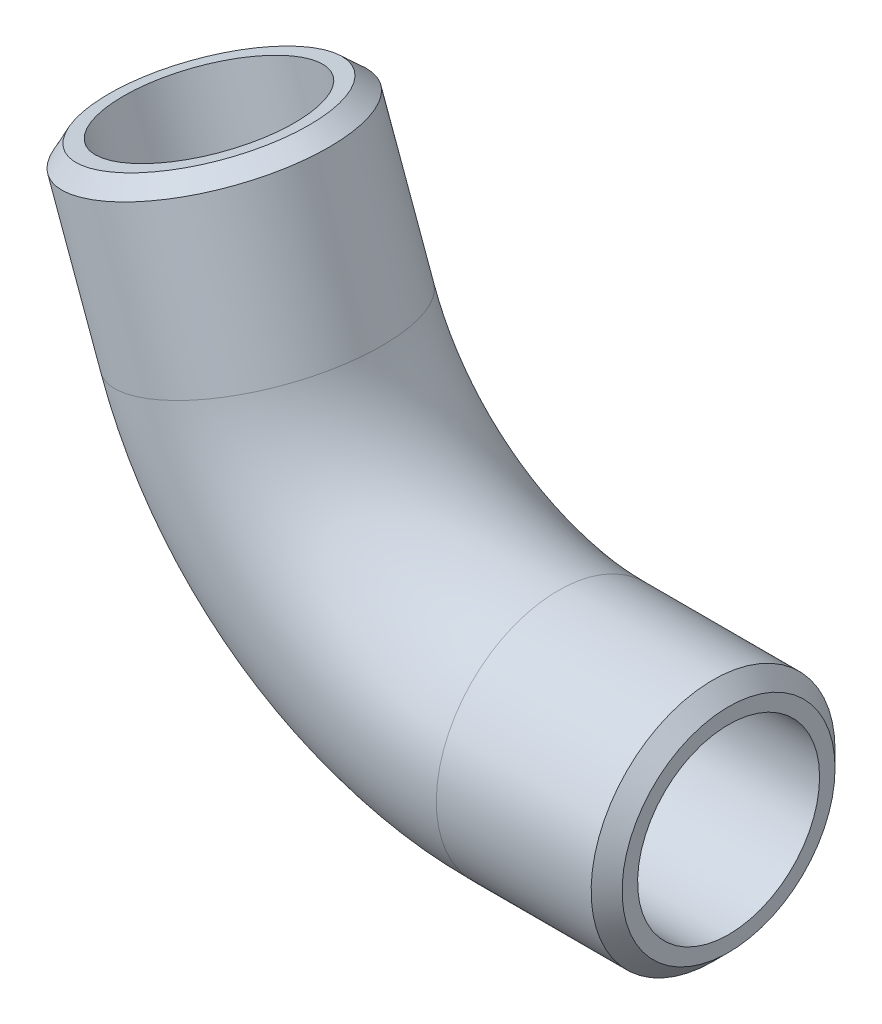
ISO-10303-21;
HEADER;
FILE_DESCRIPTION(('STEP AP214'),'2;1');
FILE_NAME('part.step','',(''),(''),'','','');
FILE_SCHEMA(('AUTOMOTIVE_DESIGN { 1 0 10303 214 1 1 1 1 }'));
ENDSEC;
DATA;
#1=APPLICATION_CONTEXT('core data for automotive mechanical design processes');
#2=APPLICATION_PROTOCOL_DEFINITION('international standard','automotive_design',2000,#1);
#3=PRODUCT_CONTEXT('',#1,'mechanical');
#4=PRODUCT('Part','Part','',(#3));
#5=PRODUCT_RELATED_PRODUCT_CATEGORY('part','',(#4));
#6=PRODUCT_DEFINITION_FORMATION('','',#4);
#7=PRODUCT_DEFINITION_CONTEXT('part definition',#1,'design');
#8=PRODUCT_DEFINITION('design','',#6,#7);
#9=PRODUCT_DEFINITION_SHAPE('','',#8);
#10=(LENGTH_UNIT() NAMED_UNIT(*) SI_UNIT(.MILLI.,.METRE.));
#11=(NAMED_UNIT(*) PLANE_ANGLE_UNIT() SI_UNIT($,.RADIAN.));
#12=(NAMED_UNIT(*) SI_UNIT($,.STERADIAN.) SOLID_ANGLE_UNIT());
#13=UNCERTAINTY_MEASURE_WITH_UNIT(LENGTH_MEASURE(1.E-05),#10,'distance_accuracy_value','');
#14=(GEOMETRIC_REPRESENTATION_CONTEXT(3) GLOBAL_UNCERTAINTY_ASSIGNED_CONTEXT((#13)) GLOBAL_UNIT_ASSIGNED_CONTEXT((#10,
#11,#12)) REPRESENTATION_CONTEXT('',''));
#15=CARTESIAN_POINT('',(0.,0.,0.));
#16=DIRECTION('',(0.,0.,1.));
#17=DIRECTION('',(1.,0.,0.));
#18=AXIS2_PLACEMENT_3D('',#15,#16,#17);
#19=CARTESIAN_POINT('',(0.,0.,0.));
#20=DIRECTION('',(-1.,0.,0.));
#21=DIRECTION('',(0.,0.,1.));
#22=AXIS2_PLACEMENT_3D('',#19,#20,#21);
#23=CYLINDRICAL_SURFACE('',#22,15.75);
#24=CARTESIAN_POINT('',(-1.99999999999997,0.,0.));
#25=DIRECTION('',(1.,0.,0.));
#26=DIRECTION('',(0.,0.,-1.));
#27=AXIS2_PLACEMENT_3D('',#24,#25,#26);
#28=CIRCLE('',#27,15.75);
#29=CARTESIAN_POINT('',(-1.99999999999997,0.,-15.75));
#30=VERTEX_POINT('',#29);
#31=EDGE_CURVE('E47',#30,#30,#28,.F.);
#32=ORIENTED_EDGE('',*,*,#31,.T.);
#33=EDGE_LOOP('',(#32));
#34=FACE_BOUND('',#33,.T.);
#35=CARTESIAN_POINT('',(-21.9916984716117,0.,0.));
#36=DIRECTION('',(1.,0.,0.));
#37=DIRECTION('',(0.,0.,-1.));
#38=AXIS2_PLACEMENT_3D('',#35,#36,#37);
#39=CIRCLE('',#38,15.75);
#40=CARTESIAN_POINT('',(-21.9916984716117,-15.75,0.));
#41=VERTEX_POINT('',#40);
#42=EDGE_CURVE('E61',#41,#41,#39,.T.);
#43=ORIENTED_EDGE('',*,*,#42,.T.);
#44=EDGE_LOOP('',(#43));
#45=FACE_BOUND('',#44,.T.);
#46=ADVANCED_FACE('F35',(#34,#45),#23,.T.);
#47=CARTESIAN_POINT('',(-21.9916984716117,40.,0.));
#48=DIRECTION('',(0.,0.,-1.));
#49=DIRECTION('',(-1.,0.,0.));
#50=AXIS2_PLACEMENT_3D('',#47,#48,#49);
#51=TOROIDAL_SURFACE('',#50,40.,15.75);
#52=CARTESIAN_POINT('',(-59.579403303048,26.3191942669731,0.));
#53=DIRECTION('',(0.342020143325673,-0.939692620785907,0.));
#54=DIRECTION('',(0.,0.,-1.));
#55=AXIS2_PLACEMENT_3D('',#52,#53,#54);
#56=CIRCLE('',#55,15.75);
#57=CARTESIAN_POINT('',(-74.379562080426,20.9323770095937,0.));
#58=VERTEX_POINT('',#57);
#59=EDGE_CURVE('E57',#58,#58,#56,.T.);
#60=CARTESIAN_POINT('',(-21.9916984716117,40.,0.));
#61=DIRECTION('',(0.,0.,-1.));
#62=DIRECTION('',(-1.,0.,0.));
#63=AXIS2_PLACEMENT_3D('',#60,#61,#62);
#64=CIRCLE('',#63,55.75);
#65=EDGE_CURVE('',#41,#58,#64,.T.);
#66=ORIENTED_EDGE('',*,*,#42,.F.);
#67=ORIENTED_EDGE('',*,*,#59,.T.);
#68=ORIENTED_EDGE('',*,*,#65,.T.);
#69=ORIENTED_EDGE('',*,*,#65,.F.);
#70=EDGE_LOOP('',(#66,#68,#67,#69));
#71=FACE_BOUND('',#70,.T.);
#72=ADVANCED_FACE('F107',(#71),#51,.T.);
#73=CARTESIAN_POINT('',(-59.579403303048,26.3191942669731,0.));
#74=DIRECTION('',(-0.342020143325674,0.939692620785906,0.));
#75=DIRECTION('',(-0.939692620785907,-0.342020143325674,0.));
#76=AXIS2_PLACEMENT_3D('',#73,#74,#75);
#77=CYLINDRICAL_SURFACE('',#76,15.75);
#78=CARTESIAN_POINT('',(-66.4169668796323,45.1052457977235,0.));
#79=DIRECTION('',(0.342020143325673,-0.939692620785907,0.));
#80=DIRECTION('',(0.939692620785907,0.342020143325673,0.));
#81=AXIS2_PLACEMENT_3D('',#78,#79,#80);
#82=CIRCLE('',#81,15.75);
#83=CARTESIAN_POINT('',(-81.2171256570103,39.7184285403442,0.));
#84=VERTEX_POINT('',#83);
#85=EDGE_CURVE('E43',#84,#84,#82,.T.);
#86=CARTESIAN_POINT('',(-81.2171256570103,39.7184285403442,0.));
#87=CARTESIAN_POINT('',(-81.1459010364209,39.5227405035655,0.));
#88=CARTESIAN_POINT('',(-81.0746764158315,39.3270524667869,0.));
#89=CARTESIAN_POINT('',(-80.9322271746527,38.9356763932296,0.));
#90=CARTESIAN_POINT('',(-80.8610025540632,38.7399883564509,0.));
#91=CARTESIAN_POINT('',(-80.7185533128844,38.3486122828936,0.));
#92=CARTESIAN_POINT('',(-80.647328692295,38.152924246115,0.));
#93=CARTESIAN_POINT('',(-80.5048794511161,37.7615481725577,0.));
#94=CARTESIAN_POINT('',(-80.4336548305267,37.565860135779,0.));
#95=CARTESIAN_POINT('',(-80.2912055893479,37.1744840622217,0.));
#96=CARTESIAN_POINT('',(-80.2199809687585,36.9787960254431,0.));
#97=CARTESIAN_POINT('',(-80.0775317275796,36.5874199518858,0.));
#98=CARTESIAN_POINT('',(-80.0063071069902,36.3917319151071,0.));
#99=CARTESIAN_POINT('',(-79.8638578658114,36.0003558415498,0.));
#100=CARTESIAN_POINT('',(-79.7926332452219,35.8046678047712,0.));
#101=CARTESIAN_POINT('',(-79.6501840040431,35.4132917312139,0.));
#102=CARTESIAN_POINT('',(-79.5789593834537,35.2176036944352,0.));
#103=CARTESIAN_POINT('',(-79.4365101422748,34.8262276208779,0.));
#104=CARTESIAN_POINT('',(-79.3652855216854,34.6305395840993,0.));
#105=CARTESIAN_POINT('',(-79.2228362805066,34.239163510542,0.));
#106=CARTESIAN_POINT('',(-79.1516116599172,34.0434754737633,0.));
#107=CARTESIAN_POINT('',(-79.0091624187383,33.652099400206,0.));
#108=CARTESIAN_POINT('',(-78.9379377981489,33.4564113634273,0.));
#109=CARTESIAN_POINT('',(-78.7954885569701,33.0650352898701,0.));
#110=CARTESIAN_POINT('',(-78.7242639363806,32.8693472530914,0.));
#111=CARTESIAN_POINT('',(-78.5818146952018,32.4779711795341,0.));
#112=CARTESIAN_POINT('',(-78.5105900746124,32.2822831427554,0.));
#113=CARTESIAN_POINT('',(-78.3681408334335,31.8909070691981,0.));
#114=CARTESIAN_POINT('',(-78.2969162128441,31.6952190324195,0.));
#115=CARTESIAN_POINT('',(-78.1544669716653,31.3038429588622,0.));
#116=CARTESIAN_POINT('',(-78.0832423510759,31.1081549220835,0.));
#117=CARTESIAN_POINT('',(-77.940793109897,30.7167788485263,0.));
#118=CARTESIAN_POINT('',(-77.8695684893076,30.5210908117476,0.));
#119=CARTESIAN_POINT('',(-77.7271192481287,30.1297147381903,0.));
#120=CARTESIAN_POINT('',(-77.6558946275393,29.9340267014116,0.));
#121=CARTESIAN_POINT('',(-77.5134453863605,29.5426506278543,0.));
#122=CARTESIAN_POINT('',(-77.4422207657711,29.3469625910757,0.));
#123=CARTESIAN_POINT('',(-77.2997715245922,28.9555865175184,0.));
#124=CARTESIAN_POINT('',(-77.2285469040028,28.7598984807397,0.));
#125=CARTESIAN_POINT('',(-77.086097662824,28.3685224071824,0.));
#126=CARTESIAN_POINT('',(-77.0148730422346,28.1728343704038,0.));
#127=CARTESIAN_POINT('',(-76.8724238010557,27.7814582968465,0.));
#128=CARTESIAN_POINT('',(-76.8011991804663,27.5857702600678,0.));
#129=CARTESIAN_POINT('',(-76.6587499392875,27.1943941865105,0.));
#130=CARTESIAN_POINT('',(-76.587525318698,26.9987061497319,0.));
#131=CARTESIAN_POINT('',(-76.4450760775192,26.6073300761746,0.));
#132=CARTESIAN_POINT('',(-76.3738514569298,26.4116420393959,0.));
#133=CARTESIAN_POINT('',(-76.2314022157509,26.0202659658386,0.));
#134=CARTESIAN_POINT('',(-76.1601775951615,25.82457792906,0.));
#135=CARTESIAN_POINT('',(-76.0177283539827,25.4332018555027,0.));
#136=CARTESIAN_POINT('',(-75.9465037333933,25.237513818724,0.));
#137=CARTESIAN_POINT('',(-75.8040544922144,24.8461377451667,0.));
#138=CARTESIAN_POINT('',(-75.732829871625,24.6504497083881,0.));
#139=CARTESIAN_POINT('',(-75.5903806304462,24.2590736348308,0.));
#140=CARTESIAN_POINT('',(-75.5191560098567,24.0633855980521,0.));
#141=CARTESIAN_POINT('',(-75.3767067686779,23.6720095244948,0.));
#142=CARTESIAN_POINT('',(-75.3054821480885,23.4763214877162,0.));
#143=CARTESIAN_POINT('',(-75.1630329069096,23.0849454141589,0.));
#144=CARTESIAN_POINT('',(-75.0918082863202,22.8892573773802,0.));
#145=CARTESIAN_POINT('',(-74.9493590451414,22.4978813038229,0.));
#146=CARTESIAN_POINT('',(-74.878134424552,22.3021932670443,0.));
#147=CARTESIAN_POINT('',(-74.7356851833731,21.910817193487,0.));
#148=CARTESIAN_POINT('',(-74.6644605627837,21.7151291567083,0.));
#149=CARTESIAN_POINT('',(-74.5220113216049,21.323753083151,0.));
#150=CARTESIAN_POINT('',(-74.4507867010154,21.1280650463724,0.));
#151=CARTESIAN_POINT('',(-74.379562080426,20.9323770095937,0.));
#152=B_SPLINE_CURVE_WITH_KNOTS('',3,(#86,#87,#88,#89,#90,#91,#92,#93,#94,#95,#96,#97,#98,#99,
#100,#101,#102,#103,#104,#105,#106,#107,#108,#109,#110,#111,#112,#113,#114,#115,#116,#117,#118,
#119,#120,#121,#122,#123,#124,#125,#126,#127,#128,#129,#130,#131,#132,#133,#134,#135,#136,#137,
#138,#139,#140,#141,#142,#143,#144,#145,#146,#147,#148,#149,#150,#151),.UNSPECIFIED.,.F.,.F.,(4,
2,2,2,2,2,2,2,2,2,2,2,2,2,2,2,2,2,2,2,2,2,2,2,2,2,2,2,2,2,2,2,4),(0.,0.62474057723786,
1.24948115447573,1.87422173171359,2.49896230895146,3.12370288618932,3.74844346342719,
4.37318404066506,4.99792461790293,5.62266519514079,6.24740577237866,6.87214634961653,
7.49688692685439,8.12162750409226,8.74636808133012,9.37110865856799,9.99584923580586,
10.6205898130437,11.2453303902816,11.8700709675195,12.4948115447573,13.1195521219952,
13.7442926992331,14.3690332764709,14.9937738537088,15.6185144309467,16.2432550081845,
16.8679955854224,17.4927361626603,18.1174767398981,18.742217317136,19.3669578943739,
19.9916984716117),.UNSPECIFIED.);
#153=EDGE_CURVE('BSEAM103',#84,#58,#152,.T.);
#154=ORIENTED_EDGE('',*,*,#85,.T.);
#155=ORIENTED_EDGE('',*,*,#59,.F.);
#156=ORIENTED_EDGE('',*,*,#153,.T.);
#157=ORIENTED_EDGE('',*,*,#153,.F.);
#158=EDGE_LOOP('',(#154,#156,#155,#157));
#159=FACE_BOUND('',#158,.T.);
#160=ADVANCED_FACE('F103',(#159),#77,.T.);
#161=CARTESIAN_POINT('',(0.,0.,0.));
#162=DIRECTION('',(1.,0.,0.));
#163=DIRECTION('',(0.,0.,-1.));
#164=AXIS2_PLACEMENT_3D('',#161,#162,#163);
#165=PLANE('',#164);
#166=CARTESIAN_POINT('',(0.,0.,0.));
#167=DIRECTION('',(1.,0.,0.));
#168=DIRECTION('',(0.,0.,-1.));
#169=AXIS2_PLACEMENT_3D('',#166,#167,#168);
#170=CIRCLE('',#169,13.75);
#171=CARTESIAN_POINT('',(0.,0.,-13.75));
#172=VERTEX_POINT('',#171);
#173=EDGE_CURVE('E51',#172,#172,#170,.T.);
#174=ORIENTED_EDGE('',*,*,#173,.T.);
#175=EDGE_LOOP('',(#174));
#176=FACE_BOUND('',#175,.T.);
#177=CARTESIAN_POINT('',(0.,0.,0.));
#178=DIRECTION('',(1.,0.,0.));
#179=DIRECTION('',(0.,0.,-1.));
#180=AXIS2_PLACEMENT_3D('',#177,#178,#179);
#181=CIRCLE('',#180,11.75);
#182=CARTESIAN_POINT('',(0.,0.,-11.75));
#183=VERTEX_POINT('',#182);
#184=EDGE_CURVE('E60',#183,#183,#181,.F.);
#185=ORIENTED_EDGE('',*,*,#184,.T.);
#186=EDGE_LOOP('',(#185));
#187=FACE_BOUND('',#186,.T.);
#188=ADVANCED_FACE('F75',(#176,#187),#165,.T.);
#189=CARTESIAN_POINT('',(-67.1010071662836,46.9846310392953,0.));
#190=DIRECTION('',(0.342020143325674,-0.939692620785907,0.));
#191=DIRECTION('',(0.,0.,-1.));
#192=AXIS2_PLACEMENT_3D('',#189,#190,#191);
#193=PLANE('',#192);
#194=CARTESIAN_POINT('',(-67.1010071662836,46.9846310392953,0.));
#195=DIRECTION('',(0.342020143325674,-0.939692620785907,0.));
#196=DIRECTION('',(0.939692620785907,0.342020143325674,0.));
#197=AXIS2_PLACEMENT_3D('',#194,#195,#196);
#198=CIRCLE('',#197,13.75);
#199=CARTESIAN_POINT('',(-54.1802336304775,51.6874080100233,0.));
#200=VERTEX_POINT('',#199);
#201=EDGE_CURVE('E10',#200,#200,#198,.F.);
#202=ORIENTED_EDGE('',*,*,#201,.T.);
#203=EDGE_LOOP('',(#202));
#204=FACE_BOUND('',#203,.T.);
#205=CARTESIAN_POINT('',(-67.1010071662836,46.9846310392953,0.));
#206=DIRECTION('',(0.342020143325674,-0.939692620785907,0.));
#207=DIRECTION('',(0.,0.,-1.));
#208=AXIS2_PLACEMENT_3D('',#205,#206,#207);
#209=CIRCLE('',#208,11.75);
#210=CARTESIAN_POINT('',(-78.142395460518,42.9658943552187,0.));
#211=VERTEX_POINT('',#210);
#212=EDGE_CURVE('E56',#211,#211,#209,.F.);
#213=ORIENTED_EDGE('',*,*,#212,.F.);
#214=EDGE_LOOP('',(#213));
#215=FACE_BOUND('',#214,.T.);
#216=ADVANCED_FACE('F80',(#204,#215),#193,.F.);
#217=CARTESIAN_POINT('',(0.,0.,0.));
#218=DIRECTION('',(-1.,0.,0.));
#219=DIRECTION('',(0.,0.,1.));
#220=AXIS2_PLACEMENT_3D('',#217,#218,#219);
#221=CYLINDRICAL_SURFACE('',#220,11.75);
#222=CARTESIAN_POINT('',(-21.9916984716117,0.,0.));
#223=DIRECTION('',(1.,0.,0.));
#224=DIRECTION('',(0.,0.,-1.));
#225=AXIS2_PLACEMENT_3D('',#222,#223,#224);
#226=CIRCLE('',#225,11.75);
#227=CARTESIAN_POINT('',(-21.9916984716117,-11.75,0.));
#228=VERTEX_POINT('',#227);
#229=EDGE_CURVE('E69',#228,#228,#226,.F.);
#230=ORIENTED_EDGE('',*,*,#229,.T.);
#231=EDGE_LOOP('',(#230));
#232=FACE_BOUND('',#231,.T.);
#233=ORIENTED_EDGE('',*,*,#184,.F.);
#234=EDGE_LOOP('',(#233));
#235=FACE_BOUND('',#234,.T.);
#236=ADVANCED_FACE('F77',(#232,#235),#221,.F.);
#237=CARTESIAN_POINT('',(-21.9916984716117,40.,0.));
#238=DIRECTION('',(0.,0.,-1.));
#239=DIRECTION('',(-1.,0.,0.));
#240=AXIS2_PLACEMENT_3D('',#237,#238,#239);
#241=TOROIDAL_SURFACE('',#240,40.,11.75);
#242=CARTESIAN_POINT('',(-59.579403303048,26.3191942669731,0.));
#243=DIRECTION('',(0.342020143325673,-0.939692620785907,0.));
#244=DIRECTION('',(0.,0.,-1.));
#245=AXIS2_PLACEMENT_3D('',#242,#243,#244);
#246=CIRCLE('',#245,11.75);
#247=CARTESIAN_POINT('',(-70.6207915972824,22.3004575828964,0.));
#248=VERTEX_POINT('',#247);
#249=EDGE_CURVE('E66',#248,#248,#246,.F.);
#250=CARTESIAN_POINT('',(-21.9916984716117,40.,0.));
#251=DIRECTION('',(0.,0.,-1.));
#252=DIRECTION('',(-1.,0.,0.));
#253=AXIS2_PLACEMENT_3D('',#250,#251,#252);
#254=CIRCLE('',#253,51.75);
#255=EDGE_CURVE('',#228,#248,#254,.T.);
#256=ORIENTED_EDGE('',*,*,#229,.F.);
#257=ORIENTED_EDGE('',*,*,#249,.T.);
#258=ORIENTED_EDGE('',*,*,#255,.T.);
#259=ORIENTED_EDGE('',*,*,#255,.F.);
#260=EDGE_LOOP('',(#256,#258,#257,#259));
#261=FACE_BOUND('',#260,.T.);
#262=ADVANCED_FACE('F79',(#261),#241,.F.);
#263=CARTESIAN_POINT('',(-59.579403303048,26.3191942669731,0.));
#264=DIRECTION('',(-0.342020143325674,0.939692620785906,0.));
#265=DIRECTION('',(-0.939692620785907,-0.342020143325674,0.));
#266=AXIS2_PLACEMENT_3D('',#263,#264,#265);
#267=CYLINDRICAL_SURFACE('',#266,11.75);
#268=CARTESIAN_POINT('',(-78.142395460518,42.9658943552187,0.));
#269=CARTESIAN_POINT('',(-78.064045420276,42.7506293888403,0.));
#270=CARTESIAN_POINT('',(-77.985695380034,42.535364422462,0.));
#271=CARTESIAN_POINT('',(-77.8289952995499,42.1048344897052,0.));
#272=CARTESIAN_POINT('',(-77.7506452593079,41.8895695233269,0.));
#273=CARTESIAN_POINT('',(-77.5939451788238,41.4590395905702,0.));
#274=CARTESIAN_POINT('',(-77.5155951385817,41.2437746241918,0.));
#275=CARTESIAN_POINT('',(-77.3588950580977,40.8132446914351,0.));
#276=CARTESIAN_POINT('',(-77.2805450178556,40.5979797250568,0.));
#277=CARTESIAN_POINT('',(-77.1238449373716,40.1674497923,0.));
#278=CARTESIAN_POINT('',(-77.0454948971295,39.9521848259217,0.));
#279=CARTESIAN_POINT('',(-76.8887948166454,39.521654893165,0.));
#280=CARTESIAN_POINT('',(-76.8104447764034,39.3063899267866,0.));
#281=CARTESIAN_POINT('',(-76.6537446959193,38.8758599940299,0.));
#282=CARTESIAN_POINT('',(-76.5753946556773,38.6605950276515,0.));
#283=CARTESIAN_POINT('',(-76.4186945751932,38.2300650948948,0.));
#284=CARTESIAN_POINT('',(-76.3403445349512,38.0148001285165,0.));
#285=CARTESIAN_POINT('',(-76.1836444544671,37.5842701957598,0.));
#286=CARTESIAN_POINT('',(-76.1052944142251,37.3690052293814,0.));
#287=CARTESIAN_POINT('',(-75.948594333741,36.9384752966247,0.));
#288=CARTESIAN_POINT('',(-75.8702442934989,36.7232103302463,0.));
#289=CARTESIAN_POINT('',(-75.7135442130149,36.2926803974896,0.));
#290=CARTESIAN_POINT('',(-75.6351941727728,36.0774154311113,0.));
#291=CARTESIAN_POINT('',(-75.4784940922888,35.6468854983545,0.));
#292=CARTESIAN_POINT('',(-75.4001440520467,35.4316205319762,0.));
#293=CARTESIAN_POINT('',(-75.2434439715626,35.0010905992195,0.));
#294=CARTESIAN_POINT('',(-75.1650939313206,34.7858256328411,0.));
#295=CARTESIAN_POINT('',(-75.0083938508365,34.3552957000844,0.));
#296=CARTESIAN_POINT('',(-74.9300438105945,34.140030733706,0.));
#297=CARTESIAN_POINT('',(-74.7733437301104,33.7095008009493,0.));
#298=CARTESIAN_POINT('',(-74.6949936898684,33.494235834571,0.));
#299=CARTESIAN_POINT('',(-74.5382936093843,33.0637059018143,0.));
#300=CARTESIAN_POINT('',(-74.4599435691423,32.8484409354359,0.));
#301=CARTESIAN_POINT('',(-74.3032434886582,32.4179110026792,0.));
#302=CARTESIAN_POINT('',(-74.2248934484162,32.2026460363008,0.));
#303=CARTESIAN_POINT('',(-74.0681933679321,31.7721161035441,0.));
#304=CARTESIAN_POINT('',(-73.98984332769,31.5568511371658,0.));
#305=CARTESIAN_POINT('',(-73.833143247206,31.1263212044091,0.));
#306=CARTESIAN_POINT('',(-73.7547932069639,30.9110562380307,0.));
#307=CARTESIAN_POINT('',(-73.5980931264798,30.480526305274,0.));
#308=CARTESIAN_POINT('',(-73.5197430862378,30.2652613388956,0.));
#309=CARTESIAN_POINT('',(-73.3630430057537,29.8347314061389,0.));
#310=CARTESIAN_POINT('',(-73.2846929655117,29.6194664397606,0.));
#311=CARTESIAN_POINT('',(-73.1279928850276,29.1889365070038,0.));
#312=CARTESIAN_POINT('',(-73.0496428447856,28.9736715406255,0.));
#313=CARTESIAN_POINT('',(-72.8929427643015,28.5431416078688,0.));
#314=CARTESIAN_POINT('',(-72.8145927240595,28.3278766414904,0.));
#315=CARTESIAN_POINT('',(-72.6578926435754,27.8973467087337,0.));
#316=CARTESIAN_POINT('',(-72.5795426033334,27.6820817423553,0.));
#317=CARTESIAN_POINT('',(-72.4228425228493,27.2515518095986,0.));
#318=CARTESIAN_POINT('',(-72.3444924826072,27.0362868432203,0.));
#319=CARTESIAN_POINT('',(-72.1877924021232,26.6057569104636,0.));
#320=CARTESIAN_POINT('',(-72.1094423618811,26.3904919440852,0.));
#321=CARTESIAN_POINT('',(-71.9527422813971,25.9599620113285,0.));
#322=CARTESIAN_POINT('',(-71.874392241155,25.7446970449501,0.));
#323=CARTESIAN_POINT('',(-71.7176921606709,25.3141671121934,0.));
#324=CARTESIAN_POINT('',(-71.6393421204289,25.0989021458151,0.));
#325=CARTESIAN_POINT('',(-71.4826420399448,24.6683722130584,0.));
#326=CARTESIAN_POINT('',(-71.4042919997028,24.45310724668,0.));
#327=CARTESIAN_POINT('',(-71.2475919192187,24.0225773139233,0.));
#328=CARTESIAN_POINT('',(-71.1692418789767,23.8073123475449,0.));
#329=CARTESIAN_POINT('',(-71.0125417984926,23.3767824147882,0.));
#330=CARTESIAN_POINT('',(-70.9341917582505,23.1615174484099,0.));
#331=CARTESIAN_POINT('',(-70.7774916777665,22.7309875156531,0.));
#332=CARTESIAN_POINT('',(-70.6991416375244,22.5157225492748,0.));
#333=CARTESIAN_POINT('',(-70.6207915972824,22.3004575828964,0.));
#334=B_SPLINE_CURVE_WITH_KNOTS('',3,(#268,#269,#270,#271,#272,#273,#274,#275,#276,#277,#278,
#279,#280,#281,#282,#283,#284,#285,#286,#287,#288,#289,#290,#291,#292,#293,#294,#295,#296,#297,
#298,#299,#300,#301,#302,#303,#304,#305,#306,#307,#308,#309,#310,#311,#312,#313,#314,#315,#316,
#317,#318,#319,#320,#321,#322,#323,#324,#325,#326,#327,#328,#329,#330,#331,#332,#333),
.UNSPECIFIED.,.F.,.F.,(4,2,2,2,2,2,2,2,2,2,2,2,2,2,2,2,2,2,2,2,2,2,2,2,2,2,2,2,2,2,2,2,4),(0.,
0.687240577237865,1.37448115447573,2.0617217317136,2.74896230895146,3.43620288618933,
4.1234434634272,4.81068404066507,5.49792461790293,6.1851651951408,6.87240577237867,
7.55964634961653,8.24688692685439,8.93412750409226,9.62136808133013,10.308608658568,
10.9958492358059,11.6830898130437,12.3703303902816,13.0575709675195,13.7448115447573,
14.4320521219952,15.1192926992331,15.8065332764709,16.4937738537088,17.1810144309467,
17.8682550081845,18.5554955854224,19.2427361626603,19.9299767398981,20.617217317136,
21.3044578943739,21.9916984716117),.UNSPECIFIED.);
#335=EDGE_CURVE('BSEAM87',#211,#248,#334,.T.);
#336=ORIENTED_EDGE('',*,*,#212,.T.);
#337=ORIENTED_EDGE('',*,*,#249,.F.);
#338=ORIENTED_EDGE('',*,*,#335,.T.);
#339=ORIENTED_EDGE('',*,*,#335,.F.);
#340=EDGE_LOOP('',(#336,#338,#337,#339));
#341=FACE_BOUND('',#340,.T.);
#342=ADVANCED_FACE('F87',(#341),#267,.F.);
#343=CARTESIAN_POINT('',(0.,0.,0.));
#344=DIRECTION('',(-1.,0.,0.));
#345=DIRECTION('',(0.,0.,1.));
#346=AXIS2_PLACEMENT_3D('',#343,#344,#345);
#347=CONICAL_SURFACE('',#346,13.75,0.785398163397446);
#348=ORIENTED_EDGE('',*,*,#31,.F.);
#349=EDGE_LOOP('',(#348));
#350=FACE_BOUND('',#349,.T.);
#351=ORIENTED_EDGE('',*,*,#173,.F.);
#352=EDGE_LOOP('',(#351));
#353=FACE_BOUND('',#352,.T.);
#354=ADVANCED_FACE('F92',(#350,#353),#347,.T.);
#355=CARTESIAN_POINT('',(-66.4169668796323,45.1052457977235,0.));
#356=DIRECTION('',(0.342020143325673,-0.939692620785907,0.));
#357=DIRECTION('',(0.939692620785907,0.342020143325673,0.));
#358=AXIS2_PLACEMENT_3D('',#355,#356,#357);
#359=CONICAL_SURFACE('',#358,15.75,0.785398163397452);
#360=ORIENTED_EDGE('',*,*,#201,.F.);
#361=EDGE_LOOP('',(#360));
#362=FACE_BOUND('',#361,.T.);
#363=ORIENTED_EDGE('',*,*,#85,.F.);
#364=EDGE_LOOP('',(#363));
#365=FACE_BOUND('',#364,.T.);
#366=ADVANCED_FACE('F38',(#362,#365),#359,.T.);
#367=CLOSED_SHELL('',(#46,#72,#160,#188,#216,#236,#262,#342,#354,#366));
#368=MANIFOLD_SOLID_BREP('B2',#367);
#369=ADVANCED_BREP_SHAPE_REPRESENTATION('',(#18,#368),#14);
#370=SHAPE_DEFINITION_REPRESENTATION(#9,#369);
ENDSEC;
END-ISO-10303-21;
